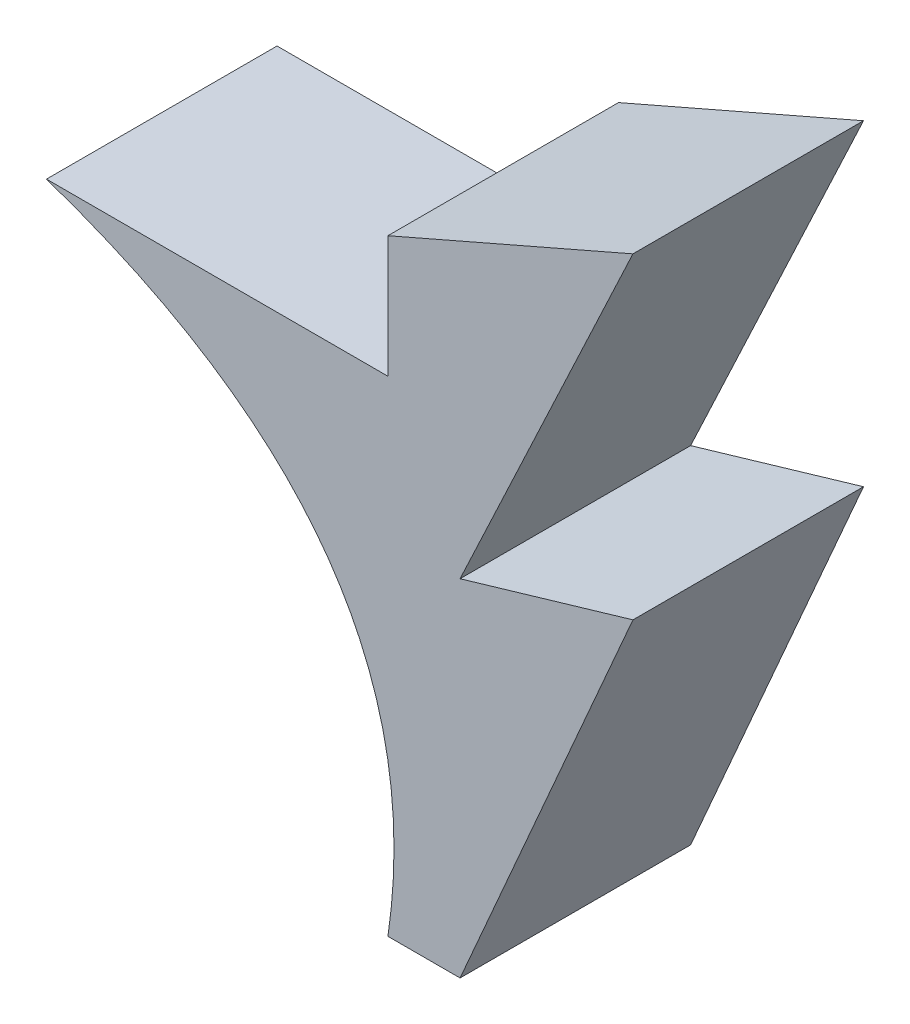
ISO-10303-21;
HEADER;
FILE_DESCRIPTION(('STEP AP214'),'2;1');
FILE_NAME('part.step','',(''),(''),'','','');
FILE_SCHEMA(('AUTOMOTIVE_DESIGN { 1 0 10303 214 1 1 1 1 }'));
ENDSEC;
DATA;
#1=APPLICATION_CONTEXT('core data for automotive mechanical design processes');
#2=APPLICATION_PROTOCOL_DEFINITION('international standard','automotive_design',2000,#1);
#3=PRODUCT_CONTEXT('',#1,'mechanical');
#4=PRODUCT('Part','Part','',(#3));
#5=PRODUCT_RELATED_PRODUCT_CATEGORY('part','',(#4));
#6=PRODUCT_DEFINITION_FORMATION('','',#4);
#7=PRODUCT_DEFINITION_CONTEXT('part definition',#1,'design');
#8=PRODUCT_DEFINITION('design','',#6,#7);
#9=PRODUCT_DEFINITION_SHAPE('','',#8);
#10=(LENGTH_UNIT() NAMED_UNIT(*) SI_UNIT(.MILLI.,.METRE.));
#11=(NAMED_UNIT(*) PLANE_ANGLE_UNIT() SI_UNIT($,.RADIAN.));
#12=(NAMED_UNIT(*) SI_UNIT($,.STERADIAN.) SOLID_ANGLE_UNIT());
#13=UNCERTAINTY_MEASURE_WITH_UNIT(LENGTH_MEASURE(1.E-05),#10,'distance_accuracy_value','');
#14=(GEOMETRIC_REPRESENTATION_CONTEXT(3) GLOBAL_UNCERTAINTY_ASSIGNED_CONTEXT((#13)) GLOBAL_UNIT_ASSIGNED_CONTEXT((#10,
#11,#12)) REPRESENTATION_CONTEXT('',''));
#15=CARTESIAN_POINT('',(0.,0.,0.));
#16=DIRECTION('',(0.,0.,1.));
#17=DIRECTION('',(1.,0.,0.));
#18=AXIS2_PLACEMENT_3D('',#15,#16,#17);
#19=CARTESIAN_POINT('',(0.,0.,50.));
#20=DIRECTION('',(1.,0.,0.));
#21=DIRECTION('',(0.,0.,-1.));
#22=AXIS2_PLACEMENT_3D('',#19,#20,#21);
#23=PLANE('',#22);
#24=DIRECTION('',(0.,0.,-1.));
#25=VECTOR('',#24,1.);
#26=CARTESIAN_POINT('',(0.,0.,50.));
#27=LINE('',#26,#25);
#28=CARTESIAN_POINT('',(0.,0.,20.));
#29=VERTEX_POINT('',#28);
#30=CARTESIAN_POINT('',(0.,0.,0.));
#31=VERTEX_POINT('',#30);
#32=EDGE_CURVE('E40',#29,#31,#27,.T.);
#33=ORIENTED_EDGE('',*,*,#32,.F.);
#34=DIRECTION('',(0.,-1.,0.));
#35=VECTOR('',#34,1.);
#36=CARTESIAN_POINT('',(0.,0.,20.));
#37=LINE('',#36,#35);
#38=CARTESIAN_POINT('',(0.,9.99999999999999,20.));
#39=VERTEX_POINT('',#38);
#40=EDGE_CURVE('E47',#39,#29,#37,.T.);
#41=ORIENTED_EDGE('',*,*,#40,.F.);
#42=DIRECTION('',(0.,0.,-1.));
#43=VECTOR('',#42,1.);
#44=CARTESIAN_POINT('',(0.,9.99999999999999,20.));
#45=LINE('',#44,#43);
#46=CARTESIAN_POINT('',(0.,9.99999999999999,30.));
#47=VERTEX_POINT('',#46);
#48=EDGE_CURVE('E342',#47,#39,#45,.T.);
#49=ORIENTED_EDGE('',*,*,#48,.F.);
#50=DIRECTION('',(0.,1.,0.));
#51=VECTOR('',#50,1.);
#52=CARTESIAN_POINT('',(0.,0.,30.));
#53=LINE('',#52,#51);
#54=CARTESIAN_POINT('',(0.,0.,30.));
#55=VERTEX_POINT('',#54);
#56=EDGE_CURVE('E347',#55,#47,#53,.T.);
#57=ORIENTED_EDGE('',*,*,#56,.F.);
#58=CARTESIAN_POINT('',(0.,0.,50.));
#59=VERTEX_POINT('',#58);
#60=EDGE_CURVE('E11',#59,#55,#27,.T.);
#61=ORIENTED_EDGE('',*,*,#60,.F.);
#62=DIRECTION('',(0.,-1.,0.));
#63=VECTOR('',#62,1.);
#64=CARTESIAN_POINT('',(0.,0.,50.));
#65=LINE('',#64,#63);
#66=CARTESIAN_POINT('',(0.,26.398160535117,50.));
#67=VERTEX_POINT('',#66);
#68=EDGE_CURVE('E162',#67,#59,#65,.T.);
#69=ORIENTED_EDGE('',*,*,#68,.F.);
#70=DIRECTION('',(0.,0.,-1.));
#71=VECTOR('',#70,1.);
#72=CARTESIAN_POINT('',(0.,26.398160535117,50.));
#73=LINE('',#72,#71);
#74=CARTESIAN_POINT('',(0.,26.398160535117,0.));
#75=VERTEX_POINT('',#74);
#76=EDGE_CURVE('E137',#67,#75,#73,.T.);
#77=ORIENTED_EDGE('',*,*,#76,.T.);
#78=DIRECTION('',(0.,-1.,0.));
#79=VECTOR('',#78,1.);
#80=CARTESIAN_POINT('',(0.,0.,0.));
#81=LINE('',#80,#79);
#82=EDGE_CURVE('E141',#75,#31,#81,.T.);
#83=ORIENTED_EDGE('',*,*,#82,.T.);
#84=EDGE_LOOP('',(#33,#41,#49,#57,#61,#69,#77,#83));
#85=FACE_BOUND('',#84,.T.);
#86=ADVANCED_FACE('F33',(#85),#23,.F.);
#87=CARTESIAN_POINT('',(-74.0495873516718,0.,50.));
#88=DIRECTION('',(0.,-1.,0.));
#89=DIRECTION('',(0.,0.,-1.));
#90=AXIS2_PLACEMENT_3D('',#87,#88,#89);
#91=PLANE('',#90);
#92=DIRECTION('',(-1.,0.,0.));
#93=VECTOR('',#92,1.);
#94=CARTESIAN_POINT('',(-74.0495873516718,0.,0.));
#95=LINE('',#94,#93);
#96=CARTESIAN_POINT('',(-74.0495873516718,0.,0.));
#97=VERTEX_POINT('',#96);
#98=EDGE_CURVE('E144',#31,#97,#95,.T.);
#99=ORIENTED_EDGE('',*,*,#98,.T.);
#100=DIRECTION('',(0.,0.,-1.));
#101=VECTOR('',#100,1.);
#102=CARTESIAN_POINT('',(-74.0495873516718,0.,50.));
#103=LINE('',#102,#101);
#104=CARTESIAN_POINT('',(-74.0495873516718,0.,50.));
#105=VERTEX_POINT('',#104);
#106=EDGE_CURVE('E171',#105,#97,#103,.T.);
#107=ORIENTED_EDGE('',*,*,#106,.F.);
#108=DIRECTION('',(-1.,0.,0.));
#109=VECTOR('',#108,1.);
#110=CARTESIAN_POINT('',(-74.0495873516718,0.,50.));
#111=LINE('',#110,#109);
#112=EDGE_CURVE('E97',#59,#105,#111,.T.);
#113=ORIENTED_EDGE('',*,*,#112,.F.);
#114=ORIENTED_EDGE('',*,*,#60,.T.);
#115=DIRECTION('',(-1.,0.,0.));
#116=VECTOR('',#115,1.);
#117=CARTESIAN_POINT('',(10.,0.,30.));
#118=LINE('',#117,#116);
#119=CARTESIAN_POINT('',(10.,0.,30.));
#120=VERTEX_POINT('',#119);
#121=EDGE_CURVE('E359',#120,#55,#118,.T.);
#122=ORIENTED_EDGE('',*,*,#121,.F.);
#123=DIRECTION('',(0.,0.,1.));
#124=VECTOR('',#123,1.);
#125=CARTESIAN_POINT('',(10.,0.,20.));
#126=LINE('',#125,#124);
#127=CARTESIAN_POINT('',(10.,0.,20.));
#128=VERTEX_POINT('',#127);
#129=EDGE_CURVE('E338',#128,#120,#126,.T.);
#130=ORIENTED_EDGE('',*,*,#129,.F.);
#131=DIRECTION('',(-1.,0.,0.));
#132=VECTOR('',#131,1.);
#133=CARTESIAN_POINT('',(10.,0.,20.));
#134=LINE('',#133,#132);
#135=EDGE_CURVE('E180',#128,#29,#134,.T.);
#136=ORIENTED_EDGE('',*,*,#135,.T.);
#137=ORIENTED_EDGE('',*,*,#32,.T.);
#138=EDGE_LOOP('',(#99,#107,#113,#114,#122,#130,#136,#137));
#139=FACE_BOUND('',#138,.T.);
#140=ADVANCED_FACE('F178',(#139),#91,.F.);
#141=CARTESIAN_POINT('',(-74.0495873516718,0.,50.));
#142=CARTESIAN_POINT('',(11.2841133536269,-28.9262046278601,50.));
#143=CARTESIAN_POINT('',(0.,-105.195940268848,50.));
#144=B_SPLINE_CURVE_WITH_KNOTS('',2,(#141,#142,#143),.UNSPECIFIED.,.F.,.F.,(3,3),(0.,1.),.UNSPECIFIED.);
#145=DIRECTION('',(0.,0.,-1.));
#146=VECTOR('',#145,1.);
#147=SURFACE_OF_LINEAR_EXTRUSION('',#144,#146);
#148=CARTESIAN_POINT('',(-74.0495873516718,0.,0.));
#149=CARTESIAN_POINT('',(11.2841133536269,-28.9262046278601,0.));
#150=CARTESIAN_POINT('',(0.,-105.195940268848,0.));
#151=B_SPLINE_CURVE_WITH_KNOTS('',2,(#148,#149,#150),.UNSPECIFIED.,.F.,.F.,(3,3),(0.,1.),.UNSPECIFIED.);
#152=CARTESIAN_POINT('',(0.,-105.195940268848,0.));
#153=VERTEX_POINT('',#152);
#154=EDGE_CURVE('E147',#97,#153,#151,.T.);
#155=ORIENTED_EDGE('',*,*,#154,.T.);
#156=DIRECTION('',(0.,0.,-1.));
#157=VECTOR('',#156,1.);
#158=CARTESIAN_POINT('',(0.,-105.195940268848,50.));
#159=LINE('',#158,#157);
#160=CARTESIAN_POINT('',(0.,-105.195940268848,50.));
#161=VERTEX_POINT('',#160);
#162=EDGE_CURVE('E169',#161,#153,#159,.T.);
#163=ORIENTED_EDGE('',*,*,#162,.F.);
#164=EDGE_CURVE('E199',#105,#161,#144,.T.);
#165=ORIENTED_EDGE('',*,*,#164,.F.);
#166=ORIENTED_EDGE('',*,*,#106,.T.);
#167=EDGE_LOOP('',(#155,#163,#165,#166));
#168=FACE_BOUND('',#167,.T.);
#169=ADVANCED_FACE('F198',(#168),#147,.F.);
#170=CARTESIAN_POINT('',(15.6404660300424,-105.195940268848,50.));
#171=DIRECTION('',(0.,1.,0.));
#172=DIRECTION('',(0.,0.,1.));
#173=AXIS2_PLACEMENT_3D('',#170,#171,#172);
#174=PLANE('',#173);
#175=DIRECTION('',(1.,0.,0.));
#176=VECTOR('',#175,1.);
#177=CARTESIAN_POINT('',(15.6404660300424,-105.195940268848,0.));
#178=LINE('',#177,#176);
#179=CARTESIAN_POINT('',(15.6404660300424,-105.195940268848,0.));
#180=VERTEX_POINT('',#179);
#181=EDGE_CURVE('E151',#153,#180,#178,.T.);
#182=ORIENTED_EDGE('',*,*,#181,.T.);
#183=DIRECTION('',(0.,0.,-1.));
#184=VECTOR('',#183,1.);
#185=CARTESIAN_POINT('',(15.6404660300424,-105.195940268848,50.));
#186=LINE('',#185,#184);
#187=CARTESIAN_POINT('',(15.6404660300424,-105.195940268848,50.));
#188=VERTEX_POINT('',#187);
#189=EDGE_CURVE('E166',#188,#180,#186,.T.);
#190=ORIENTED_EDGE('',*,*,#189,.F.);
#191=DIRECTION('',(1.,0.,0.));
#192=VECTOR('',#191,1.);
#193=CARTESIAN_POINT('',(15.6404660300424,-105.195940268848,50.));
#194=LINE('',#193,#192);
#195=EDGE_CURVE('E196',#161,#188,#194,.T.);
#196=ORIENTED_EDGE('',*,*,#195,.F.);
#197=ORIENTED_EDGE('',*,*,#162,.T.);
#198=EDGE_LOOP('',(#182,#190,#196,#197));
#199=FACE_BOUND('',#198,.T.);
#200=ADVANCED_FACE('F195',(#199),#174,.F.);
#201=CARTESIAN_POINT('',(53.1338490010869,-19.1817087470403,50.));
#202=DIRECTION('',(-0.916695964708423,0.399585420513928,0.));
#203=DIRECTION('',(-0.399585420513928,-0.916695964708424,0.));
#204=AXIS2_PLACEMENT_3D('',#201,#202,#203);
#205=PLANE('',#204);
#206=DIRECTION('',(0.399585420513928,0.916695964708424,0.));
#207=VECTOR('',#206,1.);
#208=CARTESIAN_POINT('',(53.1338490010869,-19.1817087470403,0.));
#209=LINE('',#208,#207);
#210=CARTESIAN_POINT('',(53.1338490010869,-19.1817087470403,0.));
#211=VERTEX_POINT('',#210);
#212=EDGE_CURVE('E156',#180,#211,#209,.T.);
#213=ORIENTED_EDGE('',*,*,#212,.T.);
#214=DIRECTION('',(0.,0.,-1.));
#215=VECTOR('',#214,1.);
#216=CARTESIAN_POINT('',(53.1338490010869,-19.1817087470403,50.));
#217=LINE('',#216,#215);
#218=CARTESIAN_POINT('',(53.1338490010869,-19.1817087470403,50.));
#219=VERTEX_POINT('',#218);
#220=EDGE_CURVE('E132',#219,#211,#217,.T.);
#221=ORIENTED_EDGE('',*,*,#220,.F.);
#222=DIRECTION('',(0.399585420513928,0.916695964708424,0.));
#223=VECTOR('',#222,1.);
#224=CARTESIAN_POINT('',(53.1338490010869,-19.1817087470403,50.));
#225=LINE('',#224,#223);
#226=EDGE_CURVE('E120',#188,#219,#225,.T.);
#227=ORIENTED_EDGE('',*,*,#226,.F.);
#228=ORIENTED_EDGE('',*,*,#189,.T.);
#229=EDGE_LOOP('',(#213,#221,#227,#228));
#230=FACE_BOUND('',#229,.T.);
#231=ADVANCED_FACE('F191',(#230),#205,.F.);
#232=CARTESIAN_POINT('',(15.6404660300424,-30.2091743267593,50.));
#233=DIRECTION('',(0.282166323991551,-0.959365501571271,0.));
#234=DIRECTION('',(0.959365501571271,0.282166323991551,0.));
#235=AXIS2_PLACEMENT_3D('',#232,#233,#234);
#236=PLANE('',#235);
#237=DIRECTION('',(-0.959365501571271,-0.282166323991551,0.));
#238=VECTOR('',#237,1.);
#239=CARTESIAN_POINT('',(15.6404660300424,-30.2091743267593,0.));
#240=LINE('',#239,#238);
#241=CARTESIAN_POINT('',(15.6404660300424,-30.2091743267593,0.));
#242=VERTEX_POINT('',#241);
#243=EDGE_CURVE('E129',#211,#242,#240,.T.);
#244=ORIENTED_EDGE('',*,*,#243,.T.);
#245=DIRECTION('',(0.,0.,-1.));
#246=VECTOR('',#245,1.);
#247=CARTESIAN_POINT('',(15.6404660300424,-30.2091743267593,50.));
#248=LINE('',#247,#246);
#249=CARTESIAN_POINT('',(15.6404660300424,-30.2091743267593,50.));
#250=VERTEX_POINT('',#249);
#251=EDGE_CURVE('E126',#250,#242,#248,.T.);
#252=ORIENTED_EDGE('',*,*,#251,.F.);
#253=DIRECTION('',(-0.959365501571271,-0.282166323991551,0.));
#254=VECTOR('',#253,1.);
#255=CARTESIAN_POINT('',(15.6404660300424,-30.2091743267593,50.));
#256=LINE('',#255,#254);
#257=EDGE_CURVE('E113',#219,#250,#256,.T.);
#258=ORIENTED_EDGE('',*,*,#257,.F.);
#259=ORIENTED_EDGE('',*,*,#220,.T.);
#260=EDGE_LOOP('',(#244,#252,#258,#259));
#261=FACE_BOUND('',#260,.T.);
#262=ADVANCED_FACE('F127',(#261),#236,.F.);
#263=CARTESIAN_POINT('',(53.1338490010869,49.5561600332079,50.));
#264=DIRECTION('',(-0.905007646106317,0.425395299091449,0.));
#265=DIRECTION('',(-0.425395299091449,-0.905007646106317,0.));
#266=AXIS2_PLACEMENT_3D('',#263,#264,#265);
#267=PLANE('',#266);
#268=DIRECTION('',(0.425395299091449,0.905007646106317,0.));
#269=VECTOR('',#268,1.);
#270=CARTESIAN_POINT('',(53.1338490010869,49.5561600332079,0.));
#271=LINE('',#270,#269);
#272=CARTESIAN_POINT('',(53.1338490010869,49.5561600332079,0.));
#273=VERTEX_POINT('',#272);
#274=EDGE_CURVE('E159',#242,#273,#271,.T.);
#275=ORIENTED_EDGE('',*,*,#274,.T.);
#276=DIRECTION('',(0.,0.,-1.));
#277=VECTOR('',#276,1.);
#278=CARTESIAN_POINT('',(53.1338490010869,49.5561600332079,50.));
#279=LINE('',#278,#277);
#280=CARTESIAN_POINT('',(53.1338490010869,49.5561600332079,50.));
#281=VERTEX_POINT('',#280);
#282=EDGE_CURVE('E133',#281,#273,#279,.T.);
#283=ORIENTED_EDGE('',*,*,#282,.F.);
#284=DIRECTION('',(0.425395299091449,0.905007646106317,0.));
#285=VECTOR('',#284,1.);
#286=CARTESIAN_POINT('',(53.1338490010869,49.5561600332079,50.));
#287=LINE('',#286,#285);
#288=EDGE_CURVE('E117',#250,#281,#287,.T.);
#289=ORIENTED_EDGE('',*,*,#288,.F.);
#290=ORIENTED_EDGE('',*,*,#251,.T.);
#291=EDGE_LOOP('',(#275,#283,#289,#290));
#292=FACE_BOUND('',#291,.T.);
#293=ADVANCED_FACE('F135',(#292),#267,.F.);
#294=CARTESIAN_POINT('',(0.,26.398160535117,50.));
#295=DIRECTION('',(0.399543244302601,-0.916714348056227,0.));
#296=DIRECTION('',(0.916714348056227,0.399543244302601,0.));
#297=AXIS2_PLACEMENT_3D('',#294,#295,#296);
#298=PLANE('',#297);
#299=DIRECTION('',(-0.916714348056227,-0.399543244302601,0.));
#300=VECTOR('',#299,1.);
#301=CARTESIAN_POINT('',(0.,26.398160535117,0.));
#302=LINE('',#301,#300);
#303=EDGE_CURVE('E89',#273,#75,#302,.T.);
#304=ORIENTED_EDGE('',*,*,#303,.T.);
#305=ORIENTED_EDGE('',*,*,#76,.F.);
#306=DIRECTION('',(-0.916714348056227,-0.399543244302601,0.));
#307=VECTOR('',#306,1.);
#308=CARTESIAN_POINT('',(0.,26.398160535117,50.));
#309=LINE('',#308,#307);
#310=EDGE_CURVE('E56',#281,#67,#309,.T.);
#311=ORIENTED_EDGE('',*,*,#310,.F.);
#312=ORIENTED_EDGE('',*,*,#282,.T.);
#313=EDGE_LOOP('',(#304,#305,#311,#312));
#314=FACE_BOUND('',#313,.T.);
#315=ADVANCED_FACE('F188',(#314),#298,.F.);
#316=CARTESIAN_POINT('',(-12.8703401611045,-40.7620873811421,50.));
#317=DIRECTION('',(0.,0.,1.));
#318=DIRECTION('',(1.,0.,0.));
#319=AXIS2_PLACEMENT_3D('',#316,#317,#318);
#320=PLANE('',#319);
#321=ORIENTED_EDGE('',*,*,#68,.T.);
#322=ORIENTED_EDGE('',*,*,#112,.T.);
#323=ORIENTED_EDGE('',*,*,#164,.T.);
#324=ORIENTED_EDGE('',*,*,#195,.T.);
#325=ORIENTED_EDGE('',*,*,#226,.T.);
#326=ORIENTED_EDGE('',*,*,#257,.T.);
#327=ORIENTED_EDGE('',*,*,#288,.T.);
#328=ORIENTED_EDGE('',*,*,#310,.T.);
#329=EDGE_LOOP('',(#321,#322,#323,#324,#325,#326,#327,#328));
#330=FACE_BOUND('',#329,.T.);
#331=ADVANCED_FACE('F115',(#330),#320,.T.);
#332=CARTESIAN_POINT('',(-12.8703401611045,-40.7620873811421,0.));
#333=DIRECTION('',(0.,0.,1.));
#334=DIRECTION('',(1.,0.,0.));
#335=AXIS2_PLACEMENT_3D('',#332,#333,#334);
#336=PLANE('',#335);
#337=ORIENTED_EDGE('',*,*,#82,.F.);
#338=ORIENTED_EDGE('',*,*,#303,.F.);
#339=ORIENTED_EDGE('',*,*,#274,.F.);
#340=ORIENTED_EDGE('',*,*,#243,.F.);
#341=ORIENTED_EDGE('',*,*,#212,.F.);
#342=ORIENTED_EDGE('',*,*,#181,.F.);
#343=ORIENTED_EDGE('',*,*,#154,.F.);
#344=ORIENTED_EDGE('',*,*,#98,.F.);
#345=EDGE_LOOP('',(#337,#338,#339,#340,#341,#342,#343,#344));
#346=FACE_BOUND('',#345,.T.);
#347=ADVANCED_FACE('F184',(#346),#336,.F.);
#348=CARTESIAN_POINT('',(10.,0.,20.));
#349=DIRECTION('',(0.,0.,-1.));
#350=DIRECTION('',(-1.,0.,0.));
#351=AXIS2_PLACEMENT_3D('',#348,#349,#350);
#352=PLANE('',#351);
#353=ORIENTED_EDGE('',*,*,#40,.T.);
#354=ORIENTED_EDGE('',*,*,#135,.F.);
#355=DIRECTION('',(0.,-1.,0.));
#356=VECTOR('',#355,1.);
#357=CARTESIAN_POINT('',(10.,0.,20.));
#358=LINE('',#357,#356);
#359=CARTESIAN_POINT('',(10.,9.99999999999999,20.));
#360=VERTEX_POINT('',#359);
#361=EDGE_CURVE('E335',#360,#128,#358,.T.);
#362=ORIENTED_EDGE('',*,*,#361,.F.);
#363=DIRECTION('',(-1.,0.,0.));
#364=VECTOR('',#363,1.);
#365=CARTESIAN_POINT('',(10.,9.99999999999999,20.));
#366=LINE('',#365,#364);
#367=EDGE_CURVE('E145',#360,#39,#366,.T.);
#368=ORIENTED_EDGE('',*,*,#367,.T.);
#369=EDGE_LOOP('',(#353,#354,#362,#368));
#370=FACE_BOUND('',#369,.T.);
#371=ADVANCED_FACE('F236',(#370),#352,.F.);
#372=CARTESIAN_POINT('',(10.,9.99999999999999,20.));
#373=DIRECTION('',(0.,1.,0.));
#374=DIRECTION('',(0.,0.,1.));
#375=AXIS2_PLACEMENT_3D('',#372,#373,#374);
#376=PLANE('',#375);
#377=ORIENTED_EDGE('',*,*,#48,.T.);
#378=ORIENTED_EDGE('',*,*,#367,.F.);
#379=DIRECTION('',(0.,0.,-1.));
#380=VECTOR('',#379,1.);
#381=CARTESIAN_POINT('',(10.,9.99999999999999,20.));
#382=LINE('',#381,#380);
#383=CARTESIAN_POINT('',(10.,9.99999999999999,30.));
#384=VERTEX_POINT('',#383);
#385=EDGE_CURVE('E340',#384,#360,#382,.T.);
#386=ORIENTED_EDGE('',*,*,#385,.F.);
#387=DIRECTION('',(-1.,0.,0.));
#388=VECTOR('',#387,1.);
#389=CARTESIAN_POINT('',(10.,9.99999999999999,30.));
#390=LINE('',#389,#388);
#391=EDGE_CURVE('E356',#384,#47,#390,.T.);
#392=ORIENTED_EDGE('',*,*,#391,.T.);
#393=EDGE_LOOP('',(#377,#378,#386,#392));
#394=FACE_BOUND('',#393,.T.);
#395=ADVANCED_FACE('F240',(#394),#376,.F.);
#396=CARTESIAN_POINT('',(10.,0.,30.));
#397=DIRECTION('',(0.,0.,1.));
#398=DIRECTION('',(1.,0.,0.));
#399=AXIS2_PLACEMENT_3D('',#396,#397,#398);
#400=PLANE('',#399);
#401=ORIENTED_EDGE('',*,*,#56,.T.);
#402=ORIENTED_EDGE('',*,*,#391,.F.);
#403=DIRECTION('',(0.,1.,0.));
#404=VECTOR('',#403,1.);
#405=CARTESIAN_POINT('',(10.,0.,30.));
#406=LINE('',#405,#404);
#407=EDGE_CURVE('E344',#120,#384,#406,.T.);
#408=ORIENTED_EDGE('',*,*,#407,.F.);
#409=ORIENTED_EDGE('',*,*,#121,.T.);
#410=EDGE_LOOP('',(#401,#402,#408,#409));
#411=FACE_BOUND('',#410,.T.);
#412=ADVANCED_FACE('F249',(#411),#400,.F.);
#413=CARTESIAN_POINT('',(10.,9.99999999999999,20.));
#414=DIRECTION('',(1.,0.,0.));
#415=DIRECTION('',(0.,0.,-1.));
#416=AXIS2_PLACEMENT_3D('',#413,#414,#415);
#417=PLANE('',#416);
#418=ORIENTED_EDGE('',*,*,#361,.T.);
#419=ORIENTED_EDGE('',*,*,#129,.T.);
#420=ORIENTED_EDGE('',*,*,#407,.T.);
#421=ORIENTED_EDGE('',*,*,#385,.T.);
#422=EDGE_LOOP('',(#418,#419,#420,#421));
#423=FACE_BOUND('',#422,.T.);
#424=ADVANCED_FACE('F259',(#423),#417,.F.);
#425=CLOSED_SHELL('',(#86,#140,#169,#200,#231,#262,#293,#315,#331,#347,#371,#395,#412,#424));
#426=MANIFOLD_SOLID_BREP('B2',#425);
#427=ADVANCED_BREP_SHAPE_REPRESENTATION('',(#18,#426),#14);
#428=SHAPE_DEFINITION_REPRESENTATION(#9,#427);
ENDSEC;
END-ISO-10303-21;
